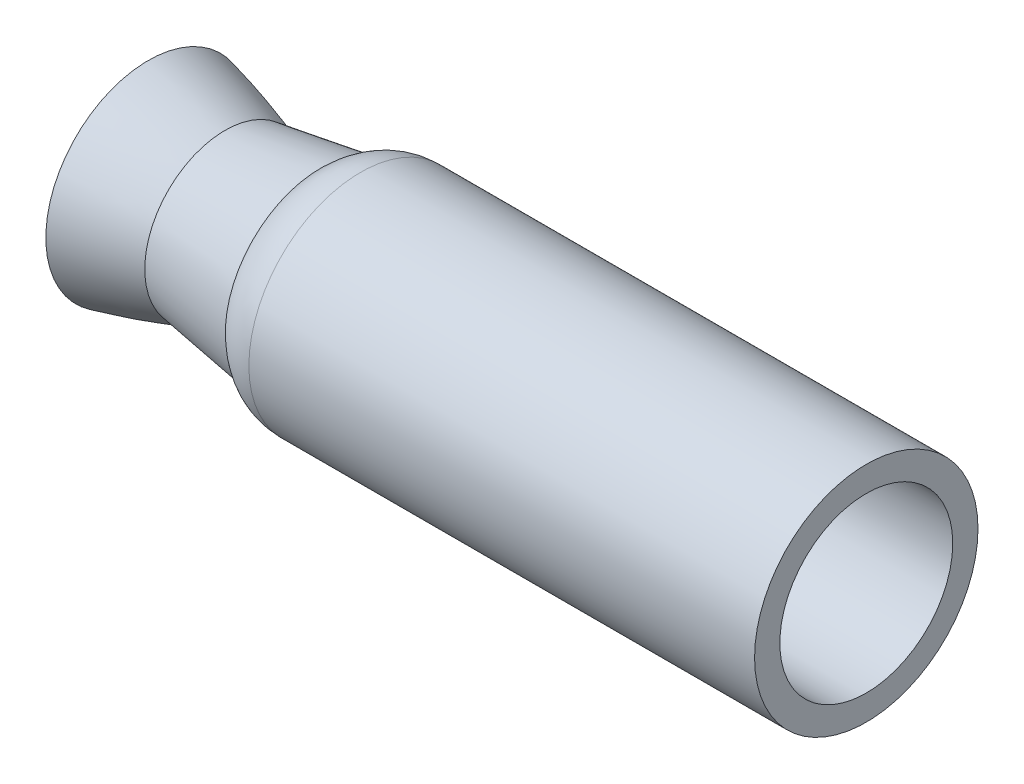
ISO-10303-21;
HEADER;
FILE_DESCRIPTION(('STEP AP214'),'2;1');
FILE_NAME('part.step','',(''),(''),'','','');
FILE_SCHEMA(('AUTOMOTIVE_DESIGN { 1 0 10303 214 1 1 1 1 }'));
ENDSEC;
DATA;
#1=APPLICATION_CONTEXT('core data for automotive mechanical design processes');
#2=APPLICATION_PROTOCOL_DEFINITION('international standard','automotive_design',2000,#1);
#3=PRODUCT_CONTEXT('',#1,'mechanical');
#4=PRODUCT('Part','Part','',(#3));
#5=PRODUCT_RELATED_PRODUCT_CATEGORY('part','',(#4));
#6=PRODUCT_DEFINITION_FORMATION('','',#4);
#7=PRODUCT_DEFINITION_CONTEXT('part definition',#1,'design');
#8=PRODUCT_DEFINITION('design','',#6,#7);
#9=PRODUCT_DEFINITION_SHAPE('','',#8);
#10=(LENGTH_UNIT() NAMED_UNIT(*) SI_UNIT(.MILLI.,.METRE.));
#11=(NAMED_UNIT(*) PLANE_ANGLE_UNIT() SI_UNIT($,.RADIAN.));
#12=(NAMED_UNIT(*) SI_UNIT($,.STERADIAN.) SOLID_ANGLE_UNIT());
#13=UNCERTAINTY_MEASURE_WITH_UNIT(LENGTH_MEASURE(1.E-05),#10,'distance_accuracy_value','');
#14=(GEOMETRIC_REPRESENTATION_CONTEXT(3) GLOBAL_UNCERTAINTY_ASSIGNED_CONTEXT((#13)) GLOBAL_UNIT_ASSIGNED_CONTEXT((#10,
#11,#12)) REPRESENTATION_CONTEXT('',''));
#15=CARTESIAN_POINT('',(0.,0.,0.));
#16=DIRECTION('',(0.,0.,1.));
#17=DIRECTION('',(1.,0.,0.));
#18=AXIS2_PLACEMENT_3D('',#15,#16,#17);
#19=CARTESIAN_POINT('',(16.2213148719435,0.,0.));
#20=DIRECTION('',(1.,0.,0.));
#21=DIRECTION('',(0.,0.,-1.));
#22=AXIS2_PLACEMENT_3D('',#19,#20,#21);
#23=CONICAL_SURFACE('',#22,30.1139260780083,0.153608941783486);
#24=CARTESIAN_POINT('',(-13.9815869337929,0.,0.));
#25=DIRECTION('',(1.,0.,0.));
#26=DIRECTION('',(0.,0.,-1.));
#27=AXIS2_PLACEMENT_3D('',#24,#25,#26);
#28=CIRCLE('',#27,25.4376523106333);
#29=CARTESIAN_POINT('',(-13.9815869337929,0.,-25.4376523106333));
#30=VERTEX_POINT('',#29);
#31=EDGE_CURVE('E10',#30,#30,#28,.T.);
#32=ORIENTED_EDGE('',*,*,#31,.T.);
#33=EDGE_LOOP('',(#32));
#34=FACE_BOUND('',#33,.T.);
#35=CARTESIAN_POINT('',(16.2213148719435,0.,0.));
#36=DIRECTION('',(1.,0.,0.));
#37=DIRECTION('',(0.,0.,-1.));
#38=AXIS2_PLACEMENT_3D('',#35,#36,#37);
#39=CIRCLE('',#38,30.1139260780083);
#40=CARTESIAN_POINT('',(16.2213148719435,0.,-30.1139260780083));
#41=VERTEX_POINT('',#40);
#42=EDGE_CURVE('E82',#41,#41,#39,.T.);
#43=ORIENTED_EDGE('',*,*,#42,.F.);
#44=EDGE_LOOP('',(#43));
#45=FACE_BOUND('',#44,.T.);
#46=ADVANCED_FACE('F42',(#34,#45),#23,.T.);
#47=CARTESIAN_POINT('',(2.34818467411675,19.2267693994655,0.));
#48=CARTESIAN_POINT('',(0.31354563692423,20.0775060385211,0.));
#49=CARTESIAN_POINT('',(-5.8002726091552,22.5182343127452,0.));
#50=CARTESIAN_POINT('',(-13.9783879953932,25.4749777747112,0.));
#51=CARTESIAN_POINT('',(-28.1601907718546,30.0701216733316,0.));
#52=CARTESIAN_POINT('',(-38.3150228285927,32.4320922392603,0.));
#53=B_SPLINE_CURVE_WITH_KNOTS('',2,(#47,#48,#49,#50,#51,#52),.UNSPECIFIED.,.F.,.F.,(3,1,1,1,3),
(0.018493807027929,0.117487589472404,0.315475154361354,0.513462719250305,1.),.UNSPECIFIED.);
#54=CARTESIAN_POINT('',(0.,0.,0.));
#55=DIRECTION('',(1.,0.,0.));
#56=AXIS1_PLACEMENT('',#54,#55);
#57=SURFACE_OF_REVOLUTION('',#53,#56);
#58=CARTESIAN_POINT('',(-38.3150228285927,0.,0.));
#59=DIRECTION('',(1.,0.,0.));
#60=DIRECTION('',(0.,0.,-1.));
#61=AXIS2_PLACEMENT_3D('',#58,#59,#60);
#62=CIRCLE('',#61,32.4320922392603);
#63=CARTESIAN_POINT('',(-38.3150228285927,0.,-32.4320922392603));
#64=VERTEX_POINT('',#63);
#65=EDGE_CURVE('E48',#64,#64,#62,.T.);
#66=ORIENTED_EDGE('',*,*,#65,.T.);
#67=EDGE_LOOP('',(#66));
#68=FACE_BOUND('',#67,.T.);
#69=ORIENTED_EDGE('',*,*,#31,.F.);
#70=EDGE_LOOP('',(#69));
#71=FACE_BOUND('',#70,.T.);
#72=ADVANCED_FACE('F105',(#68,#71),#57,.F.);
#73=CARTESIAN_POINT('',(-40.1270102829806,0.,0.));
#74=DIRECTION('',(1.,0.,0.));
#75=DIRECTION('',(0.,0.,-1.));
#76=AXIS2_PLACEMENT_3D('',#73,#74,#75);
#77=CONICAL_SURFACE('',#76,24.64,1.34231515229828);
#78=ORIENTED_EDGE('',*,*,#65,.F.);
#79=EDGE_LOOP('',(#78));
#80=FACE_BOUND('',#79,.T.);
#81=CARTESIAN_POINT('',(-40.1270102829806,0.,0.));
#82=DIRECTION('',(1.,0.,0.));
#83=DIRECTION('',(0.,0.,-1.));
#84=AXIS2_PLACEMENT_3D('',#81,#82,#83);
#85=CIRCLE('',#84,24.64);
#86=CARTESIAN_POINT('',(-40.1270102829806,0.,-24.64));
#87=VERTEX_POINT('',#86);
#88=EDGE_CURVE('E52',#87,#87,#85,.T.);
#89=ORIENTED_EDGE('',*,*,#88,.T.);
#90=EDGE_LOOP('',(#89));
#91=FACE_BOUND('',#90,.T.);
#92=ADVANCED_FACE('F101',(#80,#91),#77,.T.);
#93=CARTESIAN_POINT('',(0.,11.5361374682942,0.));
#94=CARTESIAN_POINT('',(-19.9482573544596,19.9475956971547,0.));
#95=CARTESIAN_POINT('',(-40.1270102829806,24.64,0.));
#96=B_SPLINE_CURVE_WITH_KNOTS('',2,(#93,#94,#95),.UNSPECIFIED.,.F.,.F.,(3,3),(0.,1.),.UNSPECIFIED.);
#97=CARTESIAN_POINT('',(0.,0.,0.));
#98=DIRECTION('',(1.,0.,0.));
#99=AXIS1_PLACEMENT('',#97,#98);
#100=SURFACE_OF_REVOLUTION('',#96,#99);
#101=ORIENTED_EDGE('',*,*,#88,.F.);
#102=EDGE_LOOP('',(#101));
#103=FACE_BOUND('',#102,.T.);
#104=CARTESIAN_POINT('',(0.,0.,0.));
#105=DIRECTION('',(1.,0.,0.));
#106=DIRECTION('',(0.,0.,-1.));
#107=AXIS2_PLACEMENT_3D('',#104,#105,#106);
#108=CIRCLE('',#107,11.5361374682942);
#109=CARTESIAN_POINT('',(0.,0.,-11.5361374682942));
#110=VERTEX_POINT('',#109);
#111=EDGE_CURVE('E56',#110,#110,#108,.T.);
#112=ORIENTED_EDGE('',*,*,#111,.T.);
#113=EDGE_LOOP('',(#112));
#114=FACE_BOUND('',#113,.T.);
#115=ADVANCED_FACE('F96',(#103,#114),#100,.T.);
#116=CARTESIAN_POINT('',(1.66230944505193,0.,0.));
#117=DIRECTION('',(1.,0.,0.));
#118=DIRECTION('',(0.,0.,-1.));
#119=AXIS2_PLACEMENT_3D('',#116,#117,#118);
#120=TOROIDAL_SURFACE('',#119,15.4784,4.2784);
#121=ORIENTED_EDGE('',*,*,#111,.F.);
#122=EDGE_LOOP('',(#121));
#123=FACE_BOUND('',#122,.T.);
#124=CARTESIAN_POINT('',(1.66230944505193,0.,0.));
#125=DIRECTION('',(1.,0.,0.));
#126=DIRECTION('',(0.,0.,-1.));
#127=AXIS2_PLACEMENT_3D('',#124,#125,#126);
#128=CIRCLE('',#127,11.2);
#129=CARTESIAN_POINT('',(1.66230944505193,0.,-11.2));
#130=VERTEX_POINT('',#129);
#131=EDGE_CURVE('E61',#130,#130,#128,.T.);
#132=ORIENTED_EDGE('',*,*,#131,.T.);
#133=EDGE_LOOP('',(#132));
#134=FACE_BOUND('',#133,.T.);
#135=ADVANCED_FACE('F100',(#123,#134),#120,.T.);
#136=CARTESIAN_POINT('',(1.66230944505193,0.,0.));
#137=DIRECTION('',(1.,0.,0.));
#138=DIRECTION('',(0.,0.,-1.));
#139=AXIS2_PLACEMENT_3D('',#136,#137,#138);
#140=TOROIDAL_SURFACE('',#139,28.,16.8);
#141=ORIENTED_EDGE('',*,*,#131,.F.);
#142=EDGE_LOOP('',(#141));
#143=FACE_BOUND('',#142,.T.);
#144=CARTESIAN_POINT('',(13.5417033689859,0.,0.));
#145=DIRECTION('',(1.,0.,0.));
#146=DIRECTION('',(0.,0.,-1.));
#147=AXIS2_PLACEMENT_3D('',#144,#145,#146);
#148=CIRCLE('',#147,16.120606076066);
#149=CARTESIAN_POINT('',(13.5417033689859,0.,-16.120606076066));
#150=VERTEX_POINT('',#149);
#151=EDGE_CURVE('E64',#150,#150,#148,.T.);
#152=ORIENTED_EDGE('',*,*,#151,.T.);
#153=EDGE_LOOP('',(#152));
#154=FACE_BOUND('',#153,.T.);
#155=ADVANCED_FACE('F149',(#143,#154),#140,.T.);
#156=CARTESIAN_POINT('',(21.8781691214359,0.,0.));
#157=DIRECTION('',(1.,0.,0.));
#158=DIRECTION('',(0.,0.,-1.));
#159=AXIS2_PLACEMENT_3D('',#156,#157,#158);
#160=CONICAL_SURFACE('',#159,24.457071828516,0.785398163397449);
#161=ORIENTED_EDGE('',*,*,#151,.F.);
#162=EDGE_LOOP('',(#161));
#163=FACE_BOUND('',#162,.T.);
#164=CARTESIAN_POINT('',(21.8781691214359,0.,0.));
#165=DIRECTION('',(1.,0.,0.));
#166=DIRECTION('',(0.,0.,-1.));
#167=AXIS2_PLACEMENT_3D('',#164,#165,#166);
#168=CIRCLE('',#167,24.457071828516);
#169=CARTESIAN_POINT('',(21.8781691214359,0.,-24.457071828516));
#170=VERTEX_POINT('',#169);
#171=EDGE_CURVE('E67',#170,#170,#168,.T.);
#172=ORIENTED_EDGE('',*,*,#171,.T.);
#173=EDGE_LOOP('',(#172));
#174=FACE_BOUND('',#173,.T.);
#175=ADVANCED_FACE('F143',(#163,#174),#160,.F.);
#176=CARTESIAN_POINT('',(28.9492369333014,0.,0.));
#177=DIRECTION('',(1.,0.,0.));
#178=DIRECTION('',(0.,0.,-1.));
#179=AXIS2_PLACEMENT_3D('',#176,#177,#178);
#180=TOROIDAL_SURFACE('',#179,17.3860040166505,10.);
#181=ORIENTED_EDGE('',*,*,#171,.F.);
#182=EDGE_LOOP('',(#181));
#183=FACE_BOUND('',#182,.T.);
#184=CARTESIAN_POINT('',(28.9492369333014,0.,0.));
#185=DIRECTION('',(1.,0.,0.));
#186=DIRECTION('',(0.,0.,-1.));
#187=AXIS2_PLACEMENT_3D('',#184,#185,#186);
#188=CIRCLE('',#187,27.3860040166505);
#189=CARTESIAN_POINT('',(28.9492369333014,0.,-27.3860040166505));
#190=VERTEX_POINT('',#189);
#191=EDGE_CURVE('E70',#190,#190,#188,.T.);
#192=ORIENTED_EDGE('',*,*,#191,.T.);
#193=EDGE_LOOP('',(#192));
#194=FACE_BOUND('',#193,.T.);
#195=ADVANCED_FACE('F137',(#183,#194),#180,.F.);
#196=CARTESIAN_POINT('',(0.,0.,0.));
#197=DIRECTION('',(1.,0.,0.));
#198=DIRECTION('',(0.,0.,-1.));
#199=AXIS2_PLACEMENT_3D('',#196,#197,#198);
#200=CYLINDRICAL_SURFACE('',#199,27.3860040166505);
#201=ORIENTED_EDGE('',*,*,#191,.F.);
#202=EDGE_LOOP('',(#201));
#203=FACE_BOUND('',#202,.T.);
#204=CARTESIAN_POINT('',(189.133015330605,0.,0.));
#205=DIRECTION('',(1.,0.,0.));
#206=DIRECTION('',(0.,0.,-1.));
#207=AXIS2_PLACEMENT_3D('',#204,#205,#206);
#208=CIRCLE('',#207,27.3860040166505);
#209=CARTESIAN_POINT('',(189.133015330605,0.,-27.3860040166505));
#210=VERTEX_POINT('',#209);
#211=EDGE_CURVE('E73',#210,#210,#208,.T.);
#212=ORIENTED_EDGE('',*,*,#211,.T.);
#213=EDGE_LOOP('',(#212));
#214=FACE_BOUND('',#213,.T.);
#215=ADVANCED_FACE('F132',(#203,#214),#200,.F.);
#216=CARTESIAN_POINT('',(189.133015330605,0.,0.));
#217=DIRECTION('',(1.,0.,0.));
#218=DIRECTION('',(0.,0.,-1.));
#219=AXIS2_PLACEMENT_3D('',#216,#217,#218);
#220=PLANE('',#219);
#221=CARTESIAN_POINT('',(189.133015330605,0.,0.));
#222=DIRECTION('',(1.,0.,0.));
#223=DIRECTION('',(0.,0.,-1.));
#224=AXIS2_PLACEMENT_3D('',#221,#222,#223);
#225=CIRCLE('',#224,35.3860040166505);
#226=CARTESIAN_POINT('',(189.133015330605,0.,-35.3860040166505));
#227=VERTEX_POINT('',#226);
#228=EDGE_CURVE('E76',#227,#227,#225,.T.);
#229=ORIENTED_EDGE('',*,*,#228,.T.);
#230=EDGE_LOOP('',(#229));
#231=FACE_BOUND('',#230,.T.);
#232=ORIENTED_EDGE('',*,*,#211,.F.);
#233=EDGE_LOOP('',(#232));
#234=FACE_BOUND('',#233,.T.);
#235=ADVANCED_FACE('F126',(#231,#234),#220,.T.);
#236=CARTESIAN_POINT('',(0.,0.,0.));
#237=DIRECTION('',(1.,0.,0.));
#238=DIRECTION('',(0.,0.,-1.));
#239=AXIS2_PLACEMENT_3D('',#236,#237,#238);
#240=CYLINDRICAL_SURFACE('',#239,35.3860040166505);
#241=CARTESIAN_POINT('',(28.9492369333014,0.,0.));
#242=DIRECTION('',(1.,0.,0.));
#243=DIRECTION('',(0.,0.,-1.));
#244=AXIS2_PLACEMENT_3D('',#241,#242,#243);
#245=CIRCLE('',#244,35.3860040166505);
#246=CARTESIAN_POINT('',(28.9492369333014,0.,-35.3860040166505));
#247=VERTEX_POINT('',#246);
#248=EDGE_CURVE('E79',#247,#247,#245,.T.);
#249=ORIENTED_EDGE('',*,*,#248,.T.);
#250=EDGE_LOOP('',(#249));
#251=FACE_BOUND('',#250,.T.);
#252=ORIENTED_EDGE('',*,*,#228,.F.);
#253=EDGE_LOOP('',(#252));
#254=FACE_BOUND('',#253,.T.);
#255=ADVANCED_FACE('F120',(#251,#254),#240,.T.);
#256=CARTESIAN_POINT('',(28.9492369333014,0.,0.));
#257=DIRECTION('',(1.,0.,0.));
#258=DIRECTION('',(0.,0.,-1.));
#259=AXIS2_PLACEMENT_3D('',#256,#257,#258);
#260=DEGENERATE_TOROIDAL_SURFACE('',#259,17.3860040166505,18.,.T.);
#261=ORIENTED_EDGE('',*,*,#42,.T.);
#262=EDGE_LOOP('',(#261));
#263=FACE_BOUND('',#262,.T.);
#264=ORIENTED_EDGE('',*,*,#248,.F.);
#265=EDGE_LOOP('',(#264));
#266=FACE_BOUND('',#265,.T.);
#267=ADVANCED_FACE('F117',(#263,#266),#260,.T.);
#268=CLOSED_SHELL('',(#46,#72,#92,#115,#135,#155,#175,#195,#215,#235,#255,#267));
#269=MANIFOLD_SOLID_BREP('B2',#268);
#270=ADVANCED_BREP_SHAPE_REPRESENTATION('',(#18,#269),#14);
#271=SHAPE_DEFINITION_REPRESENTATION(#9,#270);
ENDSEC;
END-ISO-10303-21;
